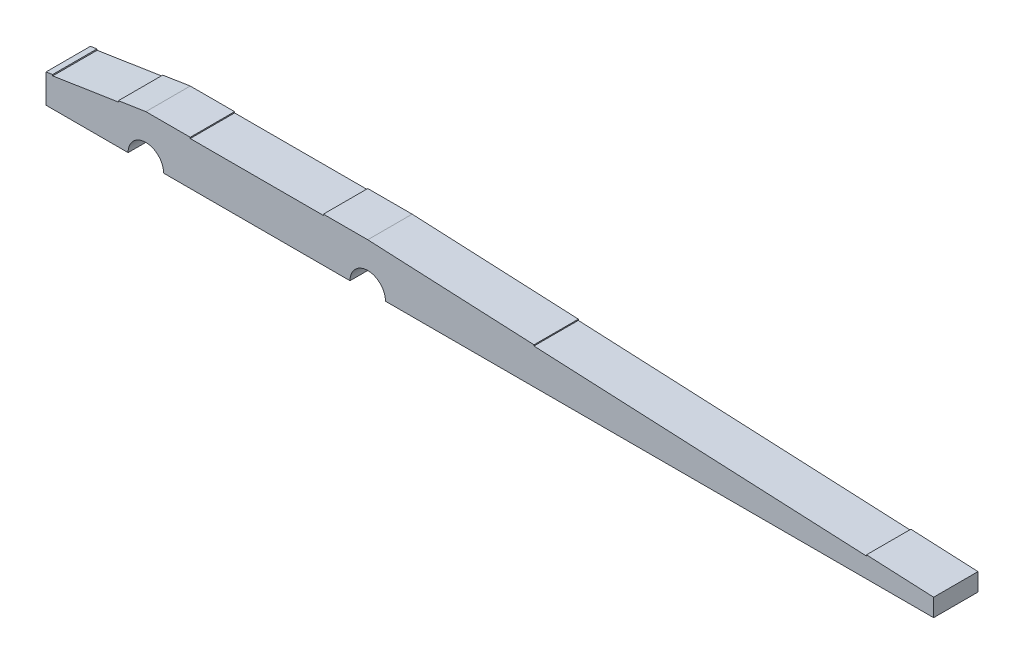
ISO-10303-21;
HEADER;
FILE_DESCRIPTION(('STEP AP214'),'2;1');
FILE_NAME('part.step','',(''),(''),'','','');
FILE_SCHEMA(('AUTOMOTIVE_DESIGN { 1 0 10303 214 1 1 1 1 }'));
ENDSEC;
DATA;
#1=APPLICATION_CONTEXT('core data for automotive mechanical design processes');
#2=APPLICATION_PROTOCOL_DEFINITION('international standard','automotive_design',2000,#1);
#3=PRODUCT_CONTEXT('',#1,'mechanical');
#4=PRODUCT('Part','Part','',(#3));
#5=PRODUCT_RELATED_PRODUCT_CATEGORY('part','',(#4));
#6=PRODUCT_DEFINITION_FORMATION('','',#4);
#7=PRODUCT_DEFINITION_CONTEXT('part definition',#1,'design');
#8=PRODUCT_DEFINITION('design','',#6,#7);
#9=PRODUCT_DEFINITION_SHAPE('','',#8);
#10=(LENGTH_UNIT() NAMED_UNIT(*) SI_UNIT(.MILLI.,.METRE.));
#11=(NAMED_UNIT(*) PLANE_ANGLE_UNIT() SI_UNIT($,.RADIAN.));
#12=(NAMED_UNIT(*) SI_UNIT($,.STERADIAN.) SOLID_ANGLE_UNIT());
#13=UNCERTAINTY_MEASURE_WITH_UNIT(LENGTH_MEASURE(1.E-05),#10,'distance_accuracy_value','');
#14=(GEOMETRIC_REPRESENTATION_CONTEXT(3) GLOBAL_UNCERTAINTY_ASSIGNED_CONTEXT((#13)) GLOBAL_UNIT_ASSIGNED_CONTEXT((#10,
#11,#12)) REPRESENTATION_CONTEXT('',''));
#15=CARTESIAN_POINT('',(0.,0.,0.));
#16=DIRECTION('',(0.,0.,1.));
#17=DIRECTION('',(1.,0.,0.));
#18=AXIS2_PLACEMENT_3D('',#15,#16,#17);
#19=CARTESIAN_POINT('',(-100.,20.,20.));
#20=DIRECTION('',(0.153707006281871,-0.988116468954882,0.));
#21=DIRECTION('',(0.988116468954882,0.153707006281871,0.));
#22=AXIS2_PLACEMENT_3D('',#19,#20,#21);
#23=PLANE('',#22);
#24=DIRECTION('',(-0.988116468954882,-0.153707006281871,0.));
#25=VECTOR('',#24,1.);
#26=CARTESIAN_POINT('',(-100.,20.,20.));
#27=LINE('',#26,#25);
#28=CARTESIAN_POINT('',(-142.035650593135,13.4611210188456,20.));
#29=VERTEX_POINT('',#28);
#30=CARTESIAN_POINT('',(-145.,13.,20.));
#31=VERTEX_POINT('',#30);
#32=EDGE_CURVE('E285',#29,#31,#27,.T.);
#33=ORIENTED_EDGE('',*,*,#32,.F.);
#34=DIRECTION('',(0.,0.,1.));
#35=VECTOR('',#34,1.);
#36=CARTESIAN_POINT('',(-142.035650593135,13.4611210188456,0.));
#37=LINE('',#36,#35);
#38=CARTESIAN_POINT('',(-142.035650593135,13.4611210188456,0.));
#39=VERTEX_POINT('',#38);
#40=EDGE_CURVE('E193',#39,#29,#37,.T.);
#41=ORIENTED_EDGE('',*,*,#40,.F.);
#42=DIRECTION('',(-0.988116468954882,-0.153707006281871,0.));
#43=VECTOR('',#42,1.);
#44=CARTESIAN_POINT('',(-100.,20.,0.));
#45=LINE('',#44,#43);
#46=CARTESIAN_POINT('',(-145.,13.,0.));
#47=VERTEX_POINT('',#46);
#48=EDGE_CURVE('E311',#39,#47,#45,.T.);
#49=ORIENTED_EDGE('',*,*,#48,.T.);
#50=DIRECTION('',(0.,0.,-1.));
#51=VECTOR('',#50,1.);
#52=CARTESIAN_POINT('',(-145.,13.,20.));
#53=LINE('',#52,#51);
#54=EDGE_CURVE('E333',#31,#47,#53,.T.);
#55=ORIENTED_EDGE('',*,*,#54,.F.);
#56=EDGE_LOOP('',(#33,#41,#49,#55));
#57=FACE_BOUND('',#56,.T.);
#58=ADVANCED_FACE('F38',(#57),#23,.F.);
#59=CARTESIAN_POINT('',(-100.,20.,20.));
#60=DIRECTION('',(0.,-1.,0.));
#61=DIRECTION('',(0.,0.,-1.));
#62=AXIS2_PLACEMENT_3D('',#59,#60,#61);
#63=PLANE('',#62);
#64=DIRECTION('',(-1.,0.,0.));
#65=VECTOR('',#64,1.);
#66=CARTESIAN_POINT('',(-100.,20.,20.));
#67=LINE('',#66,#65);
#68=CARTESIAN_POINT('',(-80.,20.,20.));
#69=VERTEX_POINT('',#68);
#70=CARTESIAN_POINT('',(-100.,20.,20.));
#71=VERTEX_POINT('',#70);
#72=EDGE_CURVE('E281',#69,#71,#67,.T.);
#73=ORIENTED_EDGE('',*,*,#72,.F.);
#74=DIRECTION('',(0.,0.,1.));
#75=VECTOR('',#74,1.);
#76=CARTESIAN_POINT('',(-80.,20.,0.));
#77=LINE('',#76,#75);
#78=CARTESIAN_POINT('',(-80.,20.,0.));
#79=VERTEX_POINT('',#78);
#80=EDGE_CURVE('E217',#79,#69,#77,.T.);
#81=ORIENTED_EDGE('',*,*,#80,.F.);
#82=DIRECTION('',(-1.,0.,0.));
#83=VECTOR('',#82,1.);
#84=CARTESIAN_POINT('',(-100.,20.,0.));
#85=LINE('',#84,#83);
#86=CARTESIAN_POINT('',(-100.,20.,0.));
#87=VERTEX_POINT('',#86);
#88=EDGE_CURVE('E307',#79,#87,#85,.T.);
#89=ORIENTED_EDGE('',*,*,#88,.T.);
#90=DIRECTION('',(0.,0.,-1.));
#91=VECTOR('',#90,1.);
#92=CARTESIAN_POINT('',(-100.,20.,20.));
#93=LINE('',#92,#91);
#94=EDGE_CURVE('E336',#71,#87,#93,.T.);
#95=ORIENTED_EDGE('',*,*,#94,.F.);
#96=EDGE_LOOP('',(#73,#81,#89,#95));
#97=FACE_BOUND('',#96,.T.);
#98=ADVANCED_FACE('F392',(#97),#63,.F.);
#99=CARTESIAN_POINT('',(0.,20.,20.));
#100=DIRECTION('',(-0.0470068032581241,-0.998894569235138,0.));
#101=DIRECTION('',(0.998894569235138,-0.0470068032581241,0.));
#102=AXIS2_PLACEMENT_3D('',#99,#100,#101);
#103=PLANE('',#102);
#104=DIRECTION('',(-0.998894569235138,0.0470068032581241,0.));
#105=VECTOR('',#104,1.);
#106=CARTESIAN_POINT('',(0.,20.,20.));
#107=LINE('',#106,#105);
#108=CARTESIAN_POINT('',(74.9170926926354,16.4744897556407,20.));
#109=VERTEX_POINT('',#108);
#110=CARTESIAN_POINT('',(0.,20.,20.));
#111=VERTEX_POINT('',#110);
#112=EDGE_CURVE('E277',#109,#111,#107,.T.);
#113=ORIENTED_EDGE('',*,*,#112,.F.);
#114=DIRECTION('',(0.,0.,1.));
#115=VECTOR('',#114,1.);
#116=CARTESIAN_POINT('',(74.9170926926354,16.4744897556407,0.));
#117=LINE('',#116,#115);
#118=CARTESIAN_POINT('',(74.9170926926354,16.4744897556407,0.));
#119=VERTEX_POINT('',#118);
#120=EDGE_CURVE('E236',#119,#109,#117,.T.);
#121=ORIENTED_EDGE('',*,*,#120,.F.);
#122=DIRECTION('',(-0.998894569235138,0.0470068032581241,0.));
#123=VECTOR('',#122,1.);
#124=CARTESIAN_POINT('',(0.,20.,0.));
#125=LINE('',#124,#123);
#126=CARTESIAN_POINT('',(0.,20.,0.));
#127=VERTEX_POINT('',#126);
#128=EDGE_CURVE('E303',#119,#127,#125,.T.);
#129=ORIENTED_EDGE('',*,*,#128,.T.);
#130=DIRECTION('',(0.,0.,-1.));
#131=VECTOR('',#130,1.);
#132=CARTESIAN_POINT('',(0.,20.,20.));
#133=LINE('',#132,#131);
#134=EDGE_CURVE('E339',#111,#127,#133,.T.);
#135=ORIENTED_EDGE('',*,*,#134,.F.);
#136=EDGE_LOOP('',(#113,#121,#129,#135));
#137=FACE_BOUND('',#136,.T.);
#138=ADVANCED_FACE('F398',(#137),#103,.F.);
#139=CARTESIAN_POINT('',(0.,0.,20.));
#140=DIRECTION('',(0.,0.,-1.));
#141=DIRECTION('',(-1.,0.,0.));
#142=AXIS2_PLACEMENT_3D('',#139,#140,#141);
#143=CYLINDRICAL_SURFACE('',#142,8.);
#144=CARTESIAN_POINT('',(0.,0.,0.));
#145=DIRECTION('',(0.,0.,-1.));
#146=DIRECTION('',(1.,0.,0.));
#147=AXIS2_PLACEMENT_3D('',#144,#145,#146);
#148=CIRCLE('',#147,8.);
#149=CARTESIAN_POINT('',(-8.,0.,0.));
#150=VERTEX_POINT('',#149);
#151=CARTESIAN_POINT('',(8.,0.,0.));
#152=VERTEX_POINT('',#151);
#153=EDGE_CURVE('E261',#150,#152,#148,.T.);
#154=ORIENTED_EDGE('',*,*,#153,.T.);
#155=DIRECTION('',(0.,0.,-1.));
#156=VECTOR('',#155,1.);
#157=CARTESIAN_POINT('',(8.,0.,20.));
#158=LINE('',#157,#156);
#159=CARTESIAN_POINT('',(8.,0.,20.));
#160=VERTEX_POINT('',#159);
#161=EDGE_CURVE('E11',#160,#152,#158,.T.);
#162=ORIENTED_EDGE('',*,*,#161,.F.);
#163=CARTESIAN_POINT('',(0.,0.,20.));
#164=DIRECTION('',(0.,0.,-1.));
#165=DIRECTION('',(1.,0.,0.));
#166=AXIS2_PLACEMENT_3D('',#163,#164,#165);
#167=CIRCLE('',#166,8.);
#168=CARTESIAN_POINT('',(-8.,0.,20.));
#169=VERTEX_POINT('',#168);
#170=EDGE_CURVE('E269',#169,#160,#167,.T.);
#171=ORIENTED_EDGE('',*,*,#170,.F.);
#172=DIRECTION('',(0.,0.,-1.));
#173=VECTOR('',#172,1.);
#174=CARTESIAN_POINT('',(-8.,0.,20.));
#175=LINE('',#174,#173);
#176=EDGE_CURVE('E296',#169,#150,#175,.T.);
#177=ORIENTED_EDGE('',*,*,#176,.T.);
#178=EDGE_LOOP('',(#154,#162,#171,#177));
#179=FACE_BOUND('',#178,.T.);
#180=ADVANCED_FACE('F40',(#179),#143,.F.);
#181=CARTESIAN_POINT('',(8.,0.,20.));
#182=DIRECTION('',(0.,1.,0.));
#183=DIRECTION('',(-1.,0.,0.));
#184=AXIS2_PLACEMENT_3D('',#181,#182,#183);
#185=PLANE('',#184);
#186=DIRECTION('',(1.,0.,0.));
#187=VECTOR('',#186,1.);
#188=CARTESIAN_POINT('',(8.,0.,0.));
#189=LINE('',#188,#187);
#190=CARTESIAN_POINT('',(255.,0.,0.));
#191=VERTEX_POINT('',#190);
#192=EDGE_CURVE('E299',#152,#191,#189,.T.);
#193=ORIENTED_EDGE('',*,*,#192,.T.);
#194=DIRECTION('',(0.,0.,-1.));
#195=VECTOR('',#194,1.);
#196=CARTESIAN_POINT('',(255.,0.,20.));
#197=LINE('',#196,#195);
#198=CARTESIAN_POINT('',(255.,0.,20.));
#199=VERTEX_POINT('',#198);
#200=EDGE_CURVE('E46',#199,#191,#197,.T.);
#201=ORIENTED_EDGE('',*,*,#200,.F.);
#202=DIRECTION('',(1.,0.,0.));
#203=VECTOR('',#202,1.);
#204=CARTESIAN_POINT('',(8.,0.,20.));
#205=LINE('',#204,#203);
#206=EDGE_CURVE('E272',#160,#199,#205,.T.);
#207=ORIENTED_EDGE('',*,*,#206,.F.);
#208=ORIENTED_EDGE('',*,*,#161,.T.);
#209=EDGE_LOOP('',(#193,#201,#207,#208));
#210=FACE_BOUND('',#209,.T.);
#211=ADVANCED_FACE('F367',(#210),#185,.F.);
#212=CARTESIAN_POINT('',(255.,8.,20.));
#213=DIRECTION('',(-1.,0.,0.));
#214=DIRECTION('',(0.,0.,1.));
#215=AXIS2_PLACEMENT_3D('',#212,#213,#214);
#216=PLANE('',#215);
#217=DIRECTION('',(0.,1.,0.));
#218=VECTOR('',#217,1.);
#219=CARTESIAN_POINT('',(255.,8.,0.));
#220=LINE('',#219,#218);
#221=CARTESIAN_POINT('',(255.,8.,0.));
#222=VERTEX_POINT('',#221);
#223=EDGE_CURVE('E301',#191,#222,#220,.T.);
#224=ORIENTED_EDGE('',*,*,#223,.T.);
#225=DIRECTION('',(0.,0.,-1.));
#226=VECTOR('',#225,1.);
#227=CARTESIAN_POINT('',(255.,8.,20.));
#228=LINE('',#227,#226);
#229=CARTESIAN_POINT('',(255.,8.,20.));
#230=VERTEX_POINT('',#229);
#231=EDGE_CURVE('E342',#230,#222,#228,.T.);
#232=ORIENTED_EDGE('',*,*,#231,.F.);
#233=DIRECTION('',(0.,1.,0.));
#234=VECTOR('',#233,1.);
#235=CARTESIAN_POINT('',(255.,8.,20.));
#236=LINE('',#235,#234);
#237=EDGE_CURVE('E275',#199,#230,#236,.T.);
#238=ORIENTED_EDGE('',*,*,#237,.F.);
#239=ORIENTED_EDGE('',*,*,#200,.T.);
#240=EDGE_LOOP('',(#224,#232,#238,#239));
#241=FACE_BOUND('',#240,.T.);
#242=ADVANCED_FACE('F349',(#241),#216,.F.);
#243=CARTESIAN_POINT('',(224.751278077906,9.42346926692207,0.));
#244=VERTEX_POINT('',#243);
#245=EDGE_CURVE('E304',#222,#244,#125,.T.);
#246=ORIENTED_EDGE('',*,*,#245,.T.);
#247=DIRECTION('',(0.,0.,-1.));
#248=VECTOR('',#247,1.);
#249=CARTESIAN_POINT('',(224.751278077906,9.42346926692207,0.));
#250=LINE('',#249,#248);
#251=CARTESIAN_POINT('',(224.751278077906,9.42346926692207,20.));
#252=VERTEX_POINT('',#251);
#253=EDGE_CURVE('E248',#252,#244,#250,.T.);
#254=ORIENTED_EDGE('',*,*,#253,.F.);
#255=EDGE_CURVE('E278',#230,#252,#107,.T.);
#256=ORIENTED_EDGE('',*,*,#255,.F.);
#257=ORIENTED_EDGE('',*,*,#231,.T.);
#258=EDGE_LOOP('',(#246,#254,#256,#257));
#259=FACE_BOUND('',#258,.T.);
#260=ADVANCED_FACE('F361',(#259),#103,.F.);
#261=CARTESIAN_POINT('',(-20.,20.,0.));
#262=VERTEX_POINT('',#261);
#263=EDGE_CURVE('E308',#127,#262,#85,.T.);
#264=ORIENTED_EDGE('',*,*,#263,.T.);
#265=DIRECTION('',(0.,0.,-1.));
#266=VECTOR('',#265,1.);
#267=CARTESIAN_POINT('',(-20.,20.,0.));
#268=LINE('',#267,#266);
#269=CARTESIAN_POINT('',(-20.,20.,20.));
#270=VERTEX_POINT('',#269);
#271=EDGE_CURVE('E226',#270,#262,#268,.T.);
#272=ORIENTED_EDGE('',*,*,#271,.F.);
#273=EDGE_CURVE('E282',#111,#270,#67,.T.);
#274=ORIENTED_EDGE('',*,*,#273,.F.);
#275=ORIENTED_EDGE('',*,*,#134,.T.);
#276=EDGE_LOOP('',(#264,#272,#274,#275));
#277=FACE_BOUND('',#276,.T.);
#278=ADVANCED_FACE('F401',(#277),#63,.F.);
#279=CARTESIAN_POINT('',(-112.392156524489,18.0723312073017,0.));
#280=VERTEX_POINT('',#279);
#281=EDGE_CURVE('E312',#87,#280,#45,.T.);
#282=ORIENTED_EDGE('',*,*,#281,.T.);
#283=DIRECTION('',(0.,0.,-1.));
#284=VECTOR('',#283,1.);
#285=CARTESIAN_POINT('',(-112.392156524489,18.0723312073017,0.));
#286=LINE('',#285,#284);
#287=CARTESIAN_POINT('',(-112.392156524489,18.0723312073017,20.));
#288=VERTEX_POINT('',#287);
#289=EDGE_CURVE('E205',#288,#280,#286,.T.);
#290=ORIENTED_EDGE('',*,*,#289,.F.);
#291=EDGE_CURVE('E286',#71,#288,#27,.T.);
#292=ORIENTED_EDGE('',*,*,#291,.F.);
#293=ORIENTED_EDGE('',*,*,#94,.T.);
#294=EDGE_LOOP('',(#282,#290,#292,#293));
#295=FACE_BOUND('',#294,.T.);
#296=ADVANCED_FACE('F394',(#295),#23,.F.);
#297=CARTESIAN_POINT('',(-145.,0.,20.));
#298=DIRECTION('',(1.,0.,0.));
#299=DIRECTION('',(0.,0.,-1.));
#300=AXIS2_PLACEMENT_3D('',#297,#298,#299);
#301=PLANE('',#300);
#302=DIRECTION('',(0.,-1.,0.));
#303=VECTOR('',#302,1.);
#304=CARTESIAN_POINT('',(-145.,0.,0.));
#305=LINE('',#304,#303);
#306=CARTESIAN_POINT('',(-145.,0.,0.));
#307=VERTEX_POINT('',#306);
#308=EDGE_CURVE('E315',#47,#307,#305,.T.);
#309=ORIENTED_EDGE('',*,*,#308,.T.);
#310=DIRECTION('',(0.,0.,-1.));
#311=VECTOR('',#310,1.);
#312=CARTESIAN_POINT('',(-145.,0.,20.));
#313=LINE('',#312,#311);
#314=CARTESIAN_POINT('',(-145.,0.,20.));
#315=VERTEX_POINT('',#314);
#316=EDGE_CURVE('E330',#315,#307,#313,.T.);
#317=ORIENTED_EDGE('',*,*,#316,.F.);
#318=DIRECTION('',(0.,-1.,0.));
#319=VECTOR('',#318,1.);
#320=CARTESIAN_POINT('',(-145.,0.,20.));
#321=LINE('',#320,#319);
#322=EDGE_CURVE('E288',#31,#315,#321,.T.);
#323=ORIENTED_EDGE('',*,*,#322,.F.);
#324=ORIENTED_EDGE('',*,*,#54,.T.);
#325=EDGE_LOOP('',(#309,#317,#323,#324));
#326=FACE_BOUND('',#325,.T.);
#327=ADVANCED_FACE('F387',(#326),#301,.F.);
#328=CARTESIAN_POINT('',(-108.,0.,20.));
#329=DIRECTION('',(0.,1.,0.));
#330=DIRECTION('',(-1.,0.,0.));
#331=AXIS2_PLACEMENT_3D('',#328,#329,#330);
#332=PLANE('',#331);
#333=DIRECTION('',(1.,0.,0.));
#334=VECTOR('',#333,1.);
#335=CARTESIAN_POINT('',(-108.,0.,0.));
#336=LINE('',#335,#334);
#337=CARTESIAN_POINT('',(-108.,0.,0.));
#338=VERTEX_POINT('',#337);
#339=EDGE_CURVE('E317',#307,#338,#336,.T.);
#340=ORIENTED_EDGE('',*,*,#339,.T.);
#341=DIRECTION('',(0.,0.,-1.));
#342=VECTOR('',#341,1.);
#343=CARTESIAN_POINT('',(-108.,0.,20.));
#344=LINE('',#343,#342);
#345=CARTESIAN_POINT('',(-108.,0.,20.));
#346=VERTEX_POINT('',#345);
#347=EDGE_CURVE('E327',#346,#338,#344,.T.);
#348=ORIENTED_EDGE('',*,*,#347,.F.);
#349=DIRECTION('',(1.,0.,0.));
#350=VECTOR('',#349,1.);
#351=CARTESIAN_POINT('',(-108.,0.,20.));
#352=LINE('',#351,#350);
#353=EDGE_CURVE('E290',#315,#346,#352,.T.);
#354=ORIENTED_EDGE('',*,*,#353,.F.);
#355=ORIENTED_EDGE('',*,*,#316,.T.);
#356=EDGE_LOOP('',(#340,#348,#354,#355));
#357=FACE_BOUND('',#356,.T.);
#358=ADVANCED_FACE('F383',(#357),#332,.F.);
#359=CARTESIAN_POINT('',(-100.,0.,20.));
#360=DIRECTION('',(0.,0.,-1.));
#361=DIRECTION('',(-1.,0.,0.));
#362=AXIS2_PLACEMENT_3D('',#359,#360,#361);
#363=CYLINDRICAL_SURFACE('',#362,8.00000000000001);
#364=CARTESIAN_POINT('',(-100.,0.,0.));
#365=DIRECTION('',(0.,0.,-1.));
#366=DIRECTION('',(1.,0.,0.));
#367=AXIS2_PLACEMENT_3D('',#364,#365,#366);
#368=CIRCLE('',#367,8.00000000000001);
#369=CARTESIAN_POINT('',(-92.,0.,0.));
#370=VERTEX_POINT('',#369);
#371=EDGE_CURVE('E319',#338,#370,#368,.T.);
#372=ORIENTED_EDGE('',*,*,#371,.T.);
#373=DIRECTION('',(0.,0.,-1.));
#374=VECTOR('',#373,1.);
#375=CARTESIAN_POINT('',(-92.,0.,20.));
#376=LINE('',#375,#374);
#377=CARTESIAN_POINT('',(-92.,0.,20.));
#378=VERTEX_POINT('',#377);
#379=EDGE_CURVE('E324',#378,#370,#376,.T.);
#380=ORIENTED_EDGE('',*,*,#379,.F.);
#381=CARTESIAN_POINT('',(-100.,0.,20.));
#382=DIRECTION('',(0.,0.,-1.));
#383=DIRECTION('',(1.,0.,0.));
#384=AXIS2_PLACEMENT_3D('',#381,#382,#383);
#385=CIRCLE('',#384,8.00000000000001);
#386=EDGE_CURVE('E292',#346,#378,#385,.T.);
#387=ORIENTED_EDGE('',*,*,#386,.F.);
#388=ORIENTED_EDGE('',*,*,#347,.T.);
#389=EDGE_LOOP('',(#372,#380,#387,#388));
#390=FACE_BOUND('',#389,.T.);
#391=ADVANCED_FACE('F379',(#390),#363,.F.);
#392=CARTESIAN_POINT('',(-8.,0.,20.));
#393=DIRECTION('',(0.,1.,0.));
#394=DIRECTION('',(-1.,0.,0.));
#395=AXIS2_PLACEMENT_3D('',#392,#393,#394);
#396=PLANE('',#395);
#397=DIRECTION('',(1.,0.,0.));
#398=VECTOR('',#397,1.);
#399=CARTESIAN_POINT('',(-8.,0.,0.));
#400=LINE('',#399,#398);
#401=EDGE_CURVE('E273',#370,#150,#400,.T.);
#402=ORIENTED_EDGE('',*,*,#401,.T.);
#403=ORIENTED_EDGE('',*,*,#176,.F.);
#404=DIRECTION('',(1.,0.,0.));
#405=VECTOR('',#404,1.);
#406=CARTESIAN_POINT('',(-8.,0.,20.));
#407=LINE('',#406,#405);
#408=EDGE_CURVE('E294',#378,#169,#407,.T.);
#409=ORIENTED_EDGE('',*,*,#408,.F.);
#410=ORIENTED_EDGE('',*,*,#379,.T.);
#411=EDGE_LOOP('',(#402,#403,#409,#410));
#412=FACE_BOUND('',#411,.T.);
#413=ADVANCED_FACE('F374',(#412),#396,.F.);
#414=CARTESIAN_POINT('',(0.,0.,20.));
#415=DIRECTION('',(0.,0.,1.));
#416=DIRECTION('',(1.,0.,0.));
#417=AXIS2_PLACEMENT_3D('',#414,#415,#416);
#418=PLANE('',#417);
#419=DIRECTION('',(-0.153707006281871,0.988116468954882,0.));
#420=VECTOR('',#419,1.);
#421=CARTESIAN_POINT('',(-141.958797089994,12.9670627843682,20.));
#422=LINE('',#421,#420);
#423=CARTESIAN_POINT('',(-141.958797089994,12.9670627843682,20.));
#424=VERTEX_POINT('',#423);
#425=EDGE_CURVE('E188',#424,#29,#422,.T.);
#426=ORIENTED_EDGE('',*,*,#425,.T.);
#427=ORIENTED_EDGE('',*,*,#32,.T.);
#428=ORIENTED_EDGE('',*,*,#322,.T.);
#429=ORIENTED_EDGE('',*,*,#353,.T.);
#430=ORIENTED_EDGE('',*,*,#386,.T.);
#431=ORIENTED_EDGE('',*,*,#408,.T.);
#432=ORIENTED_EDGE('',*,*,#170,.T.);
#433=ORIENTED_EDGE('',*,*,#206,.T.);
#434=ORIENTED_EDGE('',*,*,#237,.T.);
#435=ORIENTED_EDGE('',*,*,#255,.T.);
#436=DIRECTION('',(0.0470068032581241,0.998894569235138,0.));
#437=VECTOR('',#436,1.);
#438=CARTESIAN_POINT('',(224.727774676277,8.9240219823045,20.));
#439=LINE('',#438,#437);
#440=CARTESIAN_POINT('',(224.727774676277,8.9240219823045,20.));
#441=VERTEX_POINT('',#440);
#442=EDGE_CURVE('E265',#441,#252,#439,.T.);
#443=ORIENTED_EDGE('',*,*,#442,.F.);
#444=DIRECTION('',(0.998894569235138,-0.0470068032581241,0.));
#445=VECTOR('',#444,1.);
#446=CARTESIAN_POINT('',(74.8935892910063,15.9750424710231,20.));
#447=LINE('',#446,#445);
#448=CARTESIAN_POINT('',(74.8935892910063,15.9750424710231,20.));
#449=VERTEX_POINT('',#448);
#450=EDGE_CURVE('E247',#449,#441,#447,.T.);
#451=ORIENTED_EDGE('',*,*,#450,.F.);
#452=DIRECTION('',(0.0470068032581241,0.998894569235138,0.));
#453=VECTOR('',#452,1.);
#454=CARTESIAN_POINT('',(74.8935892910063,15.9750424710231,20.));
#455=LINE('',#454,#453);
#456=EDGE_CURVE('E256',#449,#109,#455,.T.);
#457=ORIENTED_EDGE('',*,*,#456,.T.);
#458=ORIENTED_EDGE('',*,*,#112,.T.);
#459=ORIENTED_EDGE('',*,*,#273,.T.);
#460=DIRECTION('',(0.,1.,0.));
#461=VECTOR('',#460,1.);
#462=CARTESIAN_POINT('',(-20.,19.5,20.));
#463=LINE('',#462,#461);
#464=CARTESIAN_POINT('',(-20.,19.5,20.));
#465=VERTEX_POINT('',#464);
#466=EDGE_CURVE('E240',#465,#270,#463,.T.);
#467=ORIENTED_EDGE('',*,*,#466,.F.);
#468=DIRECTION('',(1.,0.,0.));
#469=VECTOR('',#468,1.);
#470=CARTESIAN_POINT('',(-80.,19.5,20.));
#471=LINE('',#470,#469);
#472=CARTESIAN_POINT('',(-80.,19.5,20.));
#473=VERTEX_POINT('',#472);
#474=EDGE_CURVE('E225',#473,#465,#471,.T.);
#475=ORIENTED_EDGE('',*,*,#474,.F.);
#476=DIRECTION('',(0.,1.,0.));
#477=VECTOR('',#476,1.);
#478=CARTESIAN_POINT('',(-80.,19.5,20.));
#479=LINE('',#478,#477);
#480=EDGE_CURVE('E231',#473,#69,#479,.T.);
#481=ORIENTED_EDGE('',*,*,#480,.T.);
#482=ORIENTED_EDGE('',*,*,#72,.T.);
#483=ORIENTED_EDGE('',*,*,#291,.T.);
#484=DIRECTION('',(-0.153707006281871,0.988116468954882,0.));
#485=VECTOR('',#484,1.);
#486=CARTESIAN_POINT('',(-112.315303021348,17.5782729728243,20.));
#487=LINE('',#486,#485);
#488=CARTESIAN_POINT('',(-112.315303021348,17.5782729728243,20.));
#489=VERTEX_POINT('',#488);
#490=EDGE_CURVE('E197',#489,#288,#487,.T.);
#491=ORIENTED_EDGE('',*,*,#490,.F.);
#492=DIRECTION('',(0.988116468954882,0.153707006281871,0.));
#493=VECTOR('',#492,1.);
#494=CARTESIAN_POINT('',(-141.958797089994,12.9670627843682,20.));
#495=LINE('',#494,#493);
#496=EDGE_CURVE('E201',#424,#489,#495,.T.);
#497=ORIENTED_EDGE('',*,*,#496,.F.);
#498=EDGE_LOOP('',(#426,#427,#428,#429,#430,#431,#432,#433,#434,#435,#443,#451,#457,#458,#459,
#467,#475,#481,#482,#483,#491,#497));
#499=FACE_BOUND('',#498,.T.);
#500=ADVANCED_FACE('F207',(#499),#418,.T.);
#501=CARTESIAN_POINT('',(0.,0.,0.));
#502=DIRECTION('',(0.,0.,1.));
#503=DIRECTION('',(1.,0.,0.));
#504=AXIS2_PLACEMENT_3D('',#501,#502,#503);
#505=PLANE('',#504);
#506=ORIENTED_EDGE('',*,*,#48,.F.);
#507=DIRECTION('',(-0.153707006281871,0.988116468954882,0.));
#508=VECTOR('',#507,1.);
#509=CARTESIAN_POINT('',(-141.958797089994,12.9670627843682,0.));
#510=LINE('',#509,#508);
#511=CARTESIAN_POINT('',(-141.958797089994,12.9670627843682,0.));
#512=VERTEX_POINT('',#511);
#513=EDGE_CURVE('E215',#512,#39,#510,.T.);
#514=ORIENTED_EDGE('',*,*,#513,.F.);
#515=DIRECTION('',(-0.988116468954882,-0.153707006281871,0.));
#516=VECTOR('',#515,1.);
#517=CARTESIAN_POINT('',(-141.958797089994,12.9670627843682,0.));
#518=LINE('',#517,#516);
#519=CARTESIAN_POINT('',(-112.315303021348,17.5782729728243,0.));
#520=VERTEX_POINT('',#519);
#521=EDGE_CURVE('E198',#520,#512,#518,.T.);
#522=ORIENTED_EDGE('',*,*,#521,.F.);
#523=DIRECTION('',(-0.153707006281871,0.988116468954882,0.));
#524=VECTOR('',#523,1.);
#525=CARTESIAN_POINT('',(-112.315303021348,17.5782729728243,0.));
#526=LINE('',#525,#524);
#527=EDGE_CURVE('E218',#520,#280,#526,.T.);
#528=ORIENTED_EDGE('',*,*,#527,.T.);
#529=ORIENTED_EDGE('',*,*,#281,.F.);
#530=ORIENTED_EDGE('',*,*,#88,.F.);
#531=DIRECTION('',(0.,1.,0.));
#532=VECTOR('',#531,1.);
#533=CARTESIAN_POINT('',(-80.,19.5,0.));
#534=LINE('',#533,#532);
#535=CARTESIAN_POINT('',(-80.,19.5,0.));
#536=VERTEX_POINT('',#535);
#537=EDGE_CURVE('E234',#536,#79,#534,.T.);
#538=ORIENTED_EDGE('',*,*,#537,.F.);
#539=DIRECTION('',(-1.,0.,0.));
#540=VECTOR('',#539,1.);
#541=CARTESIAN_POINT('',(-80.,19.5,0.));
#542=LINE('',#541,#540);
#543=CARTESIAN_POINT('',(-20.,19.5,0.));
#544=VERTEX_POINT('',#543);
#545=EDGE_CURVE('E229',#544,#536,#542,.T.);
#546=ORIENTED_EDGE('',*,*,#545,.F.);
#547=DIRECTION('',(0.,1.,0.));
#548=VECTOR('',#547,1.);
#549=CARTESIAN_POINT('',(-20.,19.5,0.));
#550=LINE('',#549,#548);
#551=EDGE_CURVE('E237',#544,#262,#550,.T.);
#552=ORIENTED_EDGE('',*,*,#551,.T.);
#553=ORIENTED_EDGE('',*,*,#263,.F.);
#554=ORIENTED_EDGE('',*,*,#128,.F.);
#555=DIRECTION('',(0.0470068032581241,0.998894569235138,0.));
#556=VECTOR('',#555,1.);
#557=CARTESIAN_POINT('',(74.8935892910063,15.9750424710231,0.));
#558=LINE('',#557,#556);
#559=CARTESIAN_POINT('',(74.8935892910063,15.9750424710231,0.));
#560=VERTEX_POINT('',#559);
#561=EDGE_CURVE('E259',#560,#119,#558,.T.);
#562=ORIENTED_EDGE('',*,*,#561,.F.);
#563=DIRECTION('',(-0.998894569235138,0.0470068032581241,0.));
#564=VECTOR('',#563,1.);
#565=CARTESIAN_POINT('',(74.8935892910063,15.9750424710231,0.));
#566=LINE('',#565,#564);
#567=CARTESIAN_POINT('',(224.727774676277,8.92402198230451,0.));
#568=VERTEX_POINT('',#567);
#569=EDGE_CURVE('E253',#568,#560,#566,.T.);
#570=ORIENTED_EDGE('',*,*,#569,.F.);
#571=DIRECTION('',(0.0470068032581241,0.998894569235138,0.));
#572=VECTOR('',#571,1.);
#573=CARTESIAN_POINT('',(224.727774676277,8.9240219823045,0.));
#574=LINE('',#573,#572);
#575=EDGE_CURVE('E262',#568,#244,#574,.T.);
#576=ORIENTED_EDGE('',*,*,#575,.T.);
#577=ORIENTED_EDGE('',*,*,#245,.F.);
#578=ORIENTED_EDGE('',*,*,#223,.F.);
#579=ORIENTED_EDGE('',*,*,#192,.F.);
#580=ORIENTED_EDGE('',*,*,#153,.F.);
#581=ORIENTED_EDGE('',*,*,#401,.F.);
#582=ORIENTED_EDGE('',*,*,#371,.F.);
#583=ORIENTED_EDGE('',*,*,#339,.F.);
#584=ORIENTED_EDGE('',*,*,#308,.F.);
#585=EDGE_LOOP('',(#506,#514,#522,#528,#529,#530,#538,#546,#552,#553,#554,#562,#570,#576,#577,
#578,#579,#580,#581,#582,#583,#584));
#586=FACE_BOUND('',#585,.T.);
#587=ADVANCED_FACE('F355',(#586),#505,.F.);
#588=CARTESIAN_POINT('',(74.8935892910063,15.9750424710231,0.));
#589=DIRECTION('',(-0.998894569235138,0.0470068032581241,0.));
#590=DIRECTION('',(-0.0470068032581241,-0.998894569235138,0.));
#591=AXIS2_PLACEMENT_3D('',#588,#589,#590);
#592=PLANE('',#591);
#593=ORIENTED_EDGE('',*,*,#120,.T.);
#594=ORIENTED_EDGE('',*,*,#456,.F.);
#595=DIRECTION('',(0.,0.,1.));
#596=VECTOR('',#595,1.);
#597=CARTESIAN_POINT('',(74.8935892910063,15.9750424710231,0.));
#598=LINE('',#597,#596);
#599=EDGE_CURVE('E244',#560,#449,#598,.T.);
#600=ORIENTED_EDGE('',*,*,#599,.F.);
#601=ORIENTED_EDGE('',*,*,#561,.T.);
#602=EDGE_LOOP('',(#593,#594,#600,#601));
#603=FACE_BOUND('',#602,.T.);
#604=ADVANCED_FACE('F445',(#603),#592,.F.);
#605=CARTESIAN_POINT('',(224.727774676277,8.9240219823045,0.));
#606=DIRECTION('',(0.998894569235138,-0.0470068032581241,0.));
#607=DIRECTION('',(0.0470068032581241,0.998894569235138,0.));
#608=AXIS2_PLACEMENT_3D('',#605,#606,#607);
#609=PLANE('',#608);
#610=ORIENTED_EDGE('',*,*,#253,.T.);
#611=ORIENTED_EDGE('',*,*,#575,.F.);
#612=DIRECTION('',(0.,0.,-1.));
#613=VECTOR('',#612,1.);
#614=CARTESIAN_POINT('',(224.727774676277,8.9240219823045,0.));
#615=LINE('',#614,#613);
#616=EDGE_CURVE('E251',#441,#568,#615,.T.);
#617=ORIENTED_EDGE('',*,*,#616,.F.);
#618=ORIENTED_EDGE('',*,*,#442,.T.);
#619=EDGE_LOOP('',(#610,#611,#617,#618));
#620=FACE_BOUND('',#619,.T.);
#621=ADVANCED_FACE('F441',(#620),#609,.F.);
#622=CARTESIAN_POINT('',(0.915593408203834,19.4563599243315,0.));
#623=DIRECTION('',(0.0470068032581241,0.998894569235138,0.));
#624=DIRECTION('',(-0.998894569235138,0.0470068032581241,0.));
#625=AXIS2_PLACEMENT_3D('',#622,#623,#624);
#626=PLANE('',#625);
#627=ORIENTED_EDGE('',*,*,#599,.T.);
#628=ORIENTED_EDGE('',*,*,#450,.T.);
#629=ORIENTED_EDGE('',*,*,#616,.T.);
#630=ORIENTED_EDGE('',*,*,#569,.T.);
#631=EDGE_LOOP('',(#627,#628,#629,#630));
#632=FACE_BOUND('',#631,.T.);
#633=ADVANCED_FACE('F437',(#632),#626,.T.);
#634=CARTESIAN_POINT('',(-80.,19.5,0.));
#635=DIRECTION('',(-1.,0.,0.));
#636=DIRECTION('',(0.,0.,1.));
#637=AXIS2_PLACEMENT_3D('',#634,#635,#636);
#638=PLANE('',#637);
#639=ORIENTED_EDGE('',*,*,#80,.T.);
#640=ORIENTED_EDGE('',*,*,#480,.F.);
#641=DIRECTION('',(0.,0.,1.));
#642=VECTOR('',#641,1.);
#643=CARTESIAN_POINT('',(-80.,19.5,0.));
#644=LINE('',#643,#642);
#645=EDGE_CURVE('E222',#536,#473,#644,.T.);
#646=ORIENTED_EDGE('',*,*,#645,.F.);
#647=ORIENTED_EDGE('',*,*,#537,.T.);
#648=EDGE_LOOP('',(#639,#640,#646,#647));
#649=FACE_BOUND('',#648,.T.);
#650=ADVANCED_FACE('F433',(#649),#638,.F.);
#651=CARTESIAN_POINT('',(-20.,19.5,0.));
#652=DIRECTION('',(1.,0.,0.));
#653=DIRECTION('',(0.,0.,-1.));
#654=AXIS2_PLACEMENT_3D('',#651,#652,#653);
#655=PLANE('',#654);
#656=ORIENTED_EDGE('',*,*,#271,.T.);
#657=ORIENTED_EDGE('',*,*,#551,.F.);
#658=DIRECTION('',(0.,0.,-1.));
#659=VECTOR('',#658,1.);
#660=CARTESIAN_POINT('',(-20.,19.5,0.));
#661=LINE('',#660,#659);
#662=EDGE_CURVE('E61',#465,#544,#661,.T.);
#663=ORIENTED_EDGE('',*,*,#662,.F.);
#664=ORIENTED_EDGE('',*,*,#466,.T.);
#665=EDGE_LOOP('',(#656,#657,#663,#664));
#666=FACE_BOUND('',#665,.T.);
#667=ADVANCED_FACE('F430',(#666),#655,.F.);
#668=CARTESIAN_POINT('',(0.,19.5,0.));
#669=DIRECTION('',(0.,1.,0.));
#670=DIRECTION('',(0.,0.,1.));
#671=AXIS2_PLACEMENT_3D('',#668,#669,#670);
#672=PLANE('',#671);
#673=ORIENTED_EDGE('',*,*,#645,.T.);
#674=ORIENTED_EDGE('',*,*,#474,.T.);
#675=ORIENTED_EDGE('',*,*,#662,.T.);
#676=ORIENTED_EDGE('',*,*,#545,.T.);
#677=EDGE_LOOP('',(#673,#674,#675,#676));
#678=FACE_BOUND('',#677,.T.);
#679=ADVANCED_FACE('F425',(#678),#672,.T.);
#680=CARTESIAN_POINT('',(-141.958797089994,12.9670627843682,0.));
#681=DIRECTION('',(-0.988116468954882,-0.153707006281871,0.));
#682=DIRECTION('',(0.153707006281871,-0.988116468954882,0.));
#683=AXIS2_PLACEMENT_3D('',#680,#681,#682);
#684=PLANE('',#683);
#685=ORIENTED_EDGE('',*,*,#40,.T.);
#686=ORIENTED_EDGE('',*,*,#425,.F.);
#687=DIRECTION('',(0.,0.,1.));
#688=VECTOR('',#687,1.);
#689=CARTESIAN_POINT('',(-141.958797089994,12.9670627843682,0.));
#690=LINE('',#689,#688);
#691=EDGE_CURVE('E191',#512,#424,#690,.T.);
#692=ORIENTED_EDGE('',*,*,#691,.F.);
#693=ORIENTED_EDGE('',*,*,#513,.T.);
#694=EDGE_LOOP('',(#685,#686,#692,#693));
#695=FACE_BOUND('',#694,.T.);
#696=ADVANCED_FACE('F190',(#695),#684,.F.);
#697=CARTESIAN_POINT('',(-112.315303021348,17.5782729728243,0.));
#698=DIRECTION('',(0.988116468954882,0.153707006281871,0.));
#699=DIRECTION('',(-0.153707006281871,0.988116468954882,0.));
#700=AXIS2_PLACEMENT_3D('',#697,#698,#699);
#701=PLANE('',#700);
#702=ORIENTED_EDGE('',*,*,#289,.T.);
#703=ORIENTED_EDGE('',*,*,#527,.F.);
#704=DIRECTION('',(0.,0.,-1.));
#705=VECTOR('',#704,1.);
#706=CARTESIAN_POINT('',(-112.315303021348,17.5782729728243,0.));
#707=LINE('',#706,#705);
#708=EDGE_CURVE('E53',#489,#520,#707,.T.);
#709=ORIENTED_EDGE('',*,*,#708,.F.);
#710=ORIENTED_EDGE('',*,*,#490,.T.);
#711=EDGE_LOOP('',(#702,#703,#709,#710));
#712=FACE_BOUND('',#711,.T.);
#713=ADVANCED_FACE('F417',(#712),#701,.F.);
#714=CARTESIAN_POINT('',(-5.32333936088992,34.2214673200067,0.));
#715=DIRECTION('',(-0.153707006281871,0.988116468954882,0.));
#716=DIRECTION('',(-0.988116468954882,-0.153707006281871,0.));
#717=AXIS2_PLACEMENT_3D('',#714,#715,#716);
#718=PLANE('',#717);
#719=ORIENTED_EDGE('',*,*,#691,.T.);
#720=ORIENTED_EDGE('',*,*,#496,.T.);
#721=ORIENTED_EDGE('',*,*,#708,.T.);
#722=ORIENTED_EDGE('',*,*,#521,.T.);
#723=EDGE_LOOP('',(#719,#720,#721,#722));
#724=FACE_BOUND('',#723,.T.);
#725=ADVANCED_FACE('F200',(#724),#718,.T.);
#726=CLOSED_SHELL('',(#58,#98,#138,#180,#211,#242,#260,#278,#296,#327,#358,#391,#413,#500,#587,
#604,#621,#633,#650,#667,#679,#696,#713,#725));
#727=MANIFOLD_SOLID_BREP('B2',#726);
#728=ADVANCED_BREP_SHAPE_REPRESENTATION('',(#18,#727),#14);
#729=SHAPE_DEFINITION_REPRESENTATION(#9,#728);
ENDSEC;
END-ISO-10303-21;
